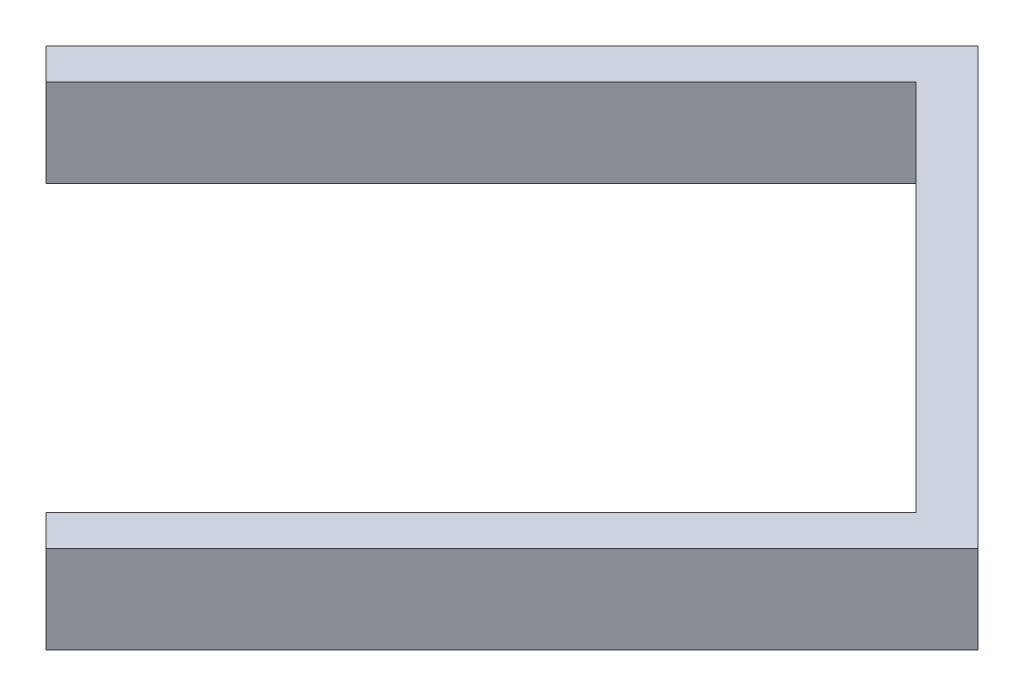
ISO-10303-21;
HEADER;
FILE_DESCRIPTION(('STEP AP214'),'2;1');
FILE_NAME('part.step','',(''),(''),'','','');
FILE_SCHEMA(('AUTOMOTIVE_DESIGN { 1 0 10303 214 1 1 1 1 }'));
ENDSEC;
DATA;
#1=APPLICATION_CONTEXT('core data for automotive mechanical design processes');
#2=APPLICATION_PROTOCOL_DEFINITION('international standard','automotive_design',2000,#1);
#3=PRODUCT_CONTEXT('',#1,'mechanical');
#4=PRODUCT('Part','Part','',(#3));
#5=PRODUCT_RELATED_PRODUCT_CATEGORY('part','',(#4));
#6=PRODUCT_DEFINITION_FORMATION('','',#4);
#7=PRODUCT_DEFINITION_CONTEXT('part definition',#1,'design');
#8=PRODUCT_DEFINITION('design','',#6,#7);
#9=PRODUCT_DEFINITION_SHAPE('','',#8);
#10=(LENGTH_UNIT() NAMED_UNIT(*) SI_UNIT(.MILLI.,.METRE.));
#11=(NAMED_UNIT(*) PLANE_ANGLE_UNIT() SI_UNIT($,.RADIAN.));
#12=(NAMED_UNIT(*) SI_UNIT($,.STERADIAN.) SOLID_ANGLE_UNIT());
#13=UNCERTAINTY_MEASURE_WITH_UNIT(LENGTH_MEASURE(1.E-05),#10,'distance_accuracy_value','');
#14=(GEOMETRIC_REPRESENTATION_CONTEXT(3) GLOBAL_UNCERTAINTY_ASSIGNED_CONTEXT((#13)) GLOBAL_UNIT_ASSIGNED_CONTEXT((#10,
#11,#12)) REPRESENTATION_CONTEXT('',''));
#15=CARTESIAN_POINT('',(0.,0.,0.));
#16=DIRECTION('',(0.,0.,1.));
#17=DIRECTION('',(1.,0.,0.));
#18=AXIS2_PLACEMENT_3D('',#15,#16,#17);
#19=CARTESIAN_POINT('',(-108.053527883218,50.8,-108.053527883218));
#20=DIRECTION('',(0.707106781186548,0.,0.707106781186547));
#21=DIRECTION('',(0.707106781186547,0.,-0.707106781186548));
#22=AXIS2_PLACEMENT_3D('',#19,#20,#21);
#23=PLANE('',#22);
#24=DIRECTION('',(-0.707106781186547,0.,0.707106781186548));
#25=VECTOR('',#24,1.);
#26=CARTESIAN_POINT('',(-108.053527883218,0.,-108.053527883218));
#27=LINE('',#26,#25);
#28=CARTESIAN_POINT('',(11.3038915641731,0.,-227.410947330609));
#29=VERTEX_POINT('',#28);
#30=CARTESIAN_POINT('',(-240.143279825763,0.,24.0362240593278));
#31=VERTEX_POINT('',#30);
#32=EDGE_CURVE('E138',#29,#31,#27,.T.);
#33=ORIENTED_EDGE('',*,*,#32,.F.);
#34=DIRECTION('',(0.,-1.,0.));
#35=VECTOR('',#34,1.);
#36=CARTESIAN_POINT('',(11.3038915641731,50.8,-227.410947330609));
#37=LINE('',#36,#35);
#38=CARTESIAN_POINT('',(11.3038915641731,50.8,-227.410947330609));
#39=VERTEX_POINT('',#38);
#40=EDGE_CURVE('E11',#39,#29,#37,.T.);
#41=ORIENTED_EDGE('',*,*,#40,.F.);
#42=DIRECTION('',(-0.707106781186547,0.,0.707106781186548));
#43=VECTOR('',#42,1.);
#44=CARTESIAN_POINT('',(-108.053527883218,50.8,-108.053527883218));
#45=LINE('',#44,#43);
#46=CARTESIAN_POINT('',(-240.143279825763,50.8,24.0362240593278));
#47=VERTEX_POINT('',#46);
#48=EDGE_CURVE('E159',#39,#47,#45,.T.);
#49=ORIENTED_EDGE('',*,*,#48,.T.);
#50=DIRECTION('',(0.,-1.,0.));
#51=VECTOR('',#50,1.);
#52=CARTESIAN_POINT('',(-240.143279825763,50.8,24.0362240593278));
#53=LINE('',#52,#51);
#54=EDGE_CURVE('E61',#47,#31,#53,.T.);
#55=ORIENTED_EDGE('',*,*,#54,.T.);
#56=EDGE_LOOP('',(#33,#41,#49,#55));
#57=FACE_BOUND('',#56,.T.);
#58=ADVANCED_FACE('F45',(#57),#23,.T.);
#59=CARTESIAN_POINT('',(119.357419447391,50.8,-119.357419447391));
#60=DIRECTION('',(-0.707106781186547,0.,0.707106781186548));
#61=DIRECTION('',(0.707106781186548,0.,0.707106781186547));
#62=AXIS2_PLACEMENT_3D('',#59,#60,#61);
#63=PLANE('',#62);
#64=CARTESIAN_POINT('',(119.357419447391,25.4,-119.357419447391));
#65=DIRECTION('',(-0.707106781186547,0.,0.707106781186548));
#66=DIRECTION('',(0.707106781186548,0.,0.707106781186547));
#67=AXIS2_PLACEMENT_3D('',#64,#65,#66);
#68=CIRCLE('',#67,6.35000000000003);
#69=CARTESIAN_POINT('',(114.867291386856,25.4,-123.847547507925));
#70=VERTEX_POINT('',#69);
#71=EDGE_CURVE('E141',#70,#70,#68,.T.);
#72=ORIENTED_EDGE('',*,*,#71,.F.);
#73=EDGE_LOOP('',(#72));
#74=FACE_BOUND('',#73,.T.);
#75=DIRECTION('',(-0.707106781186548,0.,-0.707106781186547));
#76=VECTOR('',#75,1.);
#77=CARTESIAN_POINT('',(119.357419447391,0.,-119.357419447391));
#78=LINE('',#77,#76);
#79=CARTESIAN_POINT('',(226.830038469833,0.,-11.884800424949));
#80=VERTEX_POINT('',#79);
#81=EDGE_CURVE('E140',#80,#29,#78,.T.);
#82=ORIENTED_EDGE('',*,*,#81,.F.);
#83=DIRECTION('',(0.,-1.,0.));
#84=VECTOR('',#83,1.);
#85=CARTESIAN_POINT('',(226.830038469833,50.8,-11.884800424949));
#86=LINE('',#85,#84);
#87=CARTESIAN_POINT('',(226.830038469833,50.8,-11.884800424949));
#88=VERTEX_POINT('',#87);
#89=EDGE_CURVE('E53',#88,#80,#86,.T.);
#90=ORIENTED_EDGE('',*,*,#89,.F.);
#91=DIRECTION('',(-0.707106781186548,0.,-0.707106781186547));
#92=VECTOR('',#91,1.);
#93=CARTESIAN_POINT('',(119.357419447391,50.8,-119.357419447391));
#94=LINE('',#93,#92);
#95=EDGE_CURVE('E185',#88,#39,#94,.T.);
#96=ORIENTED_EDGE('',*,*,#95,.T.);
#97=ORIENTED_EDGE('',*,*,#40,.T.);
#98=EDGE_LOOP('',(#82,#90,#96,#97));
#99=FACE_BOUND('',#98,.T.);
#100=ADVANCED_FACE('F176',(#74,#99),#63,.T.);
#101=CARTESIAN_POINT('',(107.472619022442,50.8,107.472619022442));
#102=DIRECTION('',(-0.707106781186547,0.,-0.707106781186548));
#103=DIRECTION('',(-0.707106781186548,0.,0.707106781186547));
#104=AXIS2_PLACEMENT_3D('',#101,#102,#103);
#105=PLANE('',#104);
#106=DIRECTION('',(0.707106781186548,0.,-0.707106781186547));
#107=VECTOR('',#106,1.);
#108=CARTESIAN_POINT('',(107.472619022442,0.,107.472619022442));
#109=LINE('',#108,#107);
#110=CARTESIAN_POINT('',(-24.6171329201035,0.,239.562370964987));
#111=VERTEX_POINT('',#110);
#112=EDGE_CURVE('E144',#111,#80,#109,.T.);
#113=ORIENTED_EDGE('',*,*,#112,.F.);
#114=DIRECTION('',(0.,-1.,0.));
#115=VECTOR('',#114,1.);
#116=CARTESIAN_POINT('',(-24.6171329201035,50.8,239.562370964987));
#117=LINE('',#116,#115);
#118=CARTESIAN_POINT('',(-24.6171329201035,50.8,239.562370964987));
#119=VERTEX_POINT('',#118);
#120=EDGE_CURVE('E165',#119,#111,#117,.T.);
#121=ORIENTED_EDGE('',*,*,#120,.F.);
#122=DIRECTION('',(0.707106781186548,0.,-0.707106781186547));
#123=VECTOR('',#122,1.);
#124=CARTESIAN_POINT('',(107.472619022442,50.8,107.472619022442));
#125=LINE('',#124,#123);
#126=EDGE_CURVE('E172',#119,#88,#125,.T.);
#127=ORIENTED_EDGE('',*,*,#126,.T.);
#128=ORIENTED_EDGE('',*,*,#89,.T.);
#129=EDGE_LOOP('',(#113,#121,#127,#128));
#130=FACE_BOUND('',#129,.T.);
#131=ADVANCED_FACE('F170',(#130),#105,.T.);
#132=CARTESIAN_POINT('',(-132.089751942545,50.8,132.089751942545));
#133=DIRECTION('',(-0.707106781186548,0.,0.707106781186548));
#134=DIRECTION('',(0.707106781186548,0.,0.707106781186548));
#135=AXIS2_PLACEMENT_3D('',#132,#133,#134);
#136=PLANE('',#135);
#137=DIRECTION('',(-0.707106781186548,0.,-0.707106781186548));
#138=VECTOR('',#137,1.);
#139=CARTESIAN_POINT('',(-132.089751942545,0.,132.089751942545));
#140=LINE('',#139,#138);
#141=CARTESIAN_POINT('',(-6.65662067796521,0.,257.522883207125));
#142=VERTEX_POINT('',#141);
#143=EDGE_CURVE('E147',#142,#111,#140,.T.);
#144=ORIENTED_EDGE('',*,*,#143,.F.);
#145=DIRECTION('',(0.,-1.,0.));
#146=VECTOR('',#145,1.);
#147=CARTESIAN_POINT('',(-6.65662067796521,50.8,257.522883207125));
#148=LINE('',#147,#146);
#149=CARTESIAN_POINT('',(-6.65662067796521,50.8,257.522883207125));
#150=VERTEX_POINT('',#149);
#151=EDGE_CURVE('E163',#150,#142,#148,.T.);
#152=ORIENTED_EDGE('',*,*,#151,.F.);
#153=DIRECTION('',(-0.707106781186548,0.,-0.707106781186548));
#154=VECTOR('',#153,1.);
#155=CARTESIAN_POINT('',(-132.089751942545,50.8,132.089751942545));
#156=LINE('',#155,#154);
#157=EDGE_CURVE('E184',#150,#119,#156,.T.);
#158=ORIENTED_EDGE('',*,*,#157,.T.);
#159=ORIENTED_EDGE('',*,*,#120,.T.);
#160=EDGE_LOOP('',(#144,#152,#158,#159));
#161=FACE_BOUND('',#160,.T.);
#162=ADVANCED_FACE('F182',(#161),#136,.T.);
#163=CARTESIAN_POINT('',(125.43313126458,50.8,125.43313126458));
#164=DIRECTION('',(0.707106781186548,0.,0.707106781186548));
#165=DIRECTION('',(0.707106781186548,0.,-0.707106781186548));
#166=AXIS2_PLACEMENT_3D('',#163,#164,#165);
#167=PLANE('',#166);
#168=DIRECTION('',(-0.707106781186548,0.,0.707106781186548));
#169=VECTOR('',#168,1.);
#170=CARTESIAN_POINT('',(125.43313126458,0.,125.43313126458));
#171=LINE('',#170,#169);
#172=CARTESIAN_POINT('',(262.751062954109,0.,-11.8848004249491));
#173=VERTEX_POINT('',#172);
#174=EDGE_CURVE('E150',#173,#142,#171,.T.);
#175=ORIENTED_EDGE('',*,*,#174,.F.);
#176=DIRECTION('',(0.,-1.,0.));
#177=VECTOR('',#176,1.);
#178=CARTESIAN_POINT('',(262.751062954109,50.8,-11.8848004249491));
#179=LINE('',#178,#177);
#180=CARTESIAN_POINT('',(262.751062954109,50.8,-11.8848004249491));
#181=VERTEX_POINT('',#180);
#182=EDGE_CURVE('E120',#181,#173,#179,.T.);
#183=ORIENTED_EDGE('',*,*,#182,.F.);
#184=DIRECTION('',(-0.707106781186548,0.,0.707106781186548));
#185=VECTOR('',#184,1.);
#186=CARTESIAN_POINT('',(125.43313126458,50.8,125.43313126458));
#187=LINE('',#186,#185);
#188=EDGE_CURVE('E130',#181,#150,#187,.T.);
#189=ORIENTED_EDGE('',*,*,#188,.T.);
#190=ORIENTED_EDGE('',*,*,#151,.T.);
#191=EDGE_LOOP('',(#175,#183,#189,#190));
#192=FACE_BOUND('',#191,.T.);
#193=ADVANCED_FACE('F191',(#192),#167,.T.);
#194=CARTESIAN_POINT('',(137.317931689529,50.8,-137.317931689529));
#195=DIRECTION('',(0.707106781186548,0.,-0.707106781186548));
#196=DIRECTION('',(-0.707106781186548,0.,-0.707106781186548));
#197=AXIS2_PLACEMENT_3D('',#194,#195,#196);
#198=PLANE('',#197);
#199=CARTESIAN_POINT('',(137.317931689529,25.4,-137.317931689529));
#200=DIRECTION('',(0.707106781186548,0.,-0.707106781186547));
#201=DIRECTION('',(-0.707106781186547,0.,-0.707106781186548));
#202=AXIS2_PLACEMENT_3D('',#199,#200,#201);
#203=CIRCLE('',#202,6.35000000000003);
#204=CARTESIAN_POINT('',(132.827803628995,25.4,-141.808059750064));
#205=VERTEX_POINT('',#204);
#206=EDGE_CURVE('E225',#205,#205,#203,.T.);
#207=ORIENTED_EDGE('',*,*,#206,.F.);
#208=EDGE_LOOP('',(#207));
#209=FACE_BOUND('',#208,.T.);
#210=DIRECTION('',(0.707106781186548,0.,0.707106781186548));
#211=VECTOR('',#210,1.);
#212=CARTESIAN_POINT('',(137.317931689529,0.,-137.317931689529));
#213=LINE('',#212,#211);
#214=CARTESIAN_POINT('',(11.303891564173,0.,-263.331971814885));
#215=VERTEX_POINT('',#214);
#216=EDGE_CURVE('E116',#215,#173,#213,.T.);
#217=ORIENTED_EDGE('',*,*,#216,.F.);
#218=DIRECTION('',(0.,-1.,0.));
#219=VECTOR('',#218,1.);
#220=CARTESIAN_POINT('',(11.303891564173,50.8,-263.331971814885));
#221=LINE('',#220,#219);
#222=CARTESIAN_POINT('',(11.303891564173,50.8,-263.331971814885));
#223=VERTEX_POINT('',#222);
#224=EDGE_CURVE('E111',#223,#215,#221,.T.);
#225=ORIENTED_EDGE('',*,*,#224,.F.);
#226=DIRECTION('',(0.707106781186548,0.,0.707106781186548));
#227=VECTOR('',#226,1.);
#228=CARTESIAN_POINT('',(137.317931689529,50.8,-137.317931689529));
#229=LINE('',#228,#227);
#230=EDGE_CURVE('E114',#223,#181,#229,.T.);
#231=ORIENTED_EDGE('',*,*,#230,.T.);
#232=ORIENTED_EDGE('',*,*,#182,.T.);
#233=EDGE_LOOP('',(#217,#225,#231,#232));
#234=FACE_BOUND('',#233,.T.);
#235=ADVANCED_FACE('F113',(#209,#234),#198,.T.);
#236=CARTESIAN_POINT('',(-126.014040125356,50.8,-126.014040125356));
#237=DIRECTION('',(-0.707106781186548,0.,-0.707106781186547));
#238=DIRECTION('',(-0.707106781186547,0.,0.707106781186548));
#239=AXIS2_PLACEMENT_3D('',#236,#237,#238);
#240=PLANE('',#239);
#241=DIRECTION('',(0.707106781186547,0.,-0.707106781186548));
#242=VECTOR('',#241,1.);
#243=CARTESIAN_POINT('',(-126.014040125356,0.,-126.014040125356));
#244=LINE('',#243,#242);
#245=CARTESIAN_POINT('',(-258.103792067901,0.,6.07571181718949));
#246=VERTEX_POINT('',#245);
#247=EDGE_CURVE('E154',#246,#215,#244,.T.);
#248=ORIENTED_EDGE('',*,*,#247,.F.);
#249=DIRECTION('',(0.,-1.,0.));
#250=VECTOR('',#249,1.);
#251=CARTESIAN_POINT('',(-258.103792067901,50.8,6.07571181718949));
#252=LINE('',#251,#250);
#253=CARTESIAN_POINT('',(-258.103792067901,50.8,6.07571181718949));
#254=VERTEX_POINT('',#253);
#255=EDGE_CURVE('E86',#254,#246,#252,.T.);
#256=ORIENTED_EDGE('',*,*,#255,.F.);
#257=DIRECTION('',(0.707106781186547,0.,-0.707106781186548));
#258=VECTOR('',#257,1.);
#259=CARTESIAN_POINT('',(-126.014040125356,50.8,-126.014040125356));
#260=LINE('',#259,#258);
#261=EDGE_CURVE('E127',#254,#223,#260,.T.);
#262=ORIENTED_EDGE('',*,*,#261,.T.);
#263=ORIENTED_EDGE('',*,*,#224,.T.);
#264=EDGE_LOOP('',(#248,#256,#262,#263));
#265=FACE_BOUND('',#264,.T.);
#266=ADVANCED_FACE('F132',(#265),#240,.T.);
#267=CARTESIAN_POINT('',(-132.089751942545,50.8,132.089751942545));
#268=DIRECTION('',(-0.707106781186548,0.,0.707106781186548));
#269=DIRECTION('',(0.707106781186548,0.,0.707106781186548));
#270=AXIS2_PLACEMENT_3D('',#267,#268,#269);
#271=PLANE('',#270);
#272=DIRECTION('',(-0.707106781186548,0.,-0.707106781186548));
#273=VECTOR('',#272,1.);
#274=CARTESIAN_POINT('',(-132.089751942545,0.,132.089751942545));
#275=LINE('',#274,#273);
#276=EDGE_CURVE('E156',#31,#246,#275,.T.);
#277=ORIENTED_EDGE('',*,*,#276,.F.);
#278=ORIENTED_EDGE('',*,*,#54,.F.);
#279=DIRECTION('',(-0.707106781186548,0.,-0.707106781186548));
#280=VECTOR('',#279,1.);
#281=CARTESIAN_POINT('',(-132.089751942545,50.8,132.089751942545));
#282=LINE('',#281,#280);
#283=EDGE_CURVE('E133',#47,#254,#282,.T.);
#284=ORIENTED_EDGE('',*,*,#283,.T.);
#285=ORIENTED_EDGE('',*,*,#255,.T.);
#286=EDGE_LOOP('',(#277,#278,#284,#285));
#287=FACE_BOUND('',#286,.T.);
#288=ADVANCED_FACE('F192',(#287),#271,.T.);
#289=CARTESIAN_POINT('',(0.,50.8,0.));
#290=DIRECTION('',(0.,1.,0.));
#291=DIRECTION('',(0.,0.,1.));
#292=AXIS2_PLACEMENT_3D('',#289,#290,#291);
#293=PLANE('',#292);
#294=ORIENTED_EDGE('',*,*,#48,.F.);
#295=ORIENTED_EDGE('',*,*,#95,.F.);
#296=ORIENTED_EDGE('',*,*,#126,.F.);
#297=ORIENTED_EDGE('',*,*,#157,.F.);
#298=ORIENTED_EDGE('',*,*,#188,.F.);
#299=ORIENTED_EDGE('',*,*,#230,.F.);
#300=ORIENTED_EDGE('',*,*,#261,.F.);
#301=ORIENTED_EDGE('',*,*,#283,.F.);
#302=EDGE_LOOP('',(#294,#295,#296,#297,#298,#299,#300,#301));
#303=FACE_BOUND('',#302,.T.);
#304=ADVANCED_FACE('F125',(#303),#293,.T.);
#305=CARTESIAN_POINT('',(0.,0.,0.));
#306=DIRECTION('',(0.,1.,0.));
#307=DIRECTION('',(0.,0.,1.));
#308=AXIS2_PLACEMENT_3D('',#305,#306,#307);
#309=PLANE('',#308);
#310=ORIENTED_EDGE('',*,*,#32,.T.);
#311=ORIENTED_EDGE('',*,*,#276,.T.);
#312=ORIENTED_EDGE('',*,*,#247,.T.);
#313=ORIENTED_EDGE('',*,*,#216,.T.);
#314=ORIENTED_EDGE('',*,*,#174,.T.);
#315=ORIENTED_EDGE('',*,*,#143,.T.);
#316=ORIENTED_EDGE('',*,*,#112,.T.);
#317=ORIENTED_EDGE('',*,*,#81,.T.);
#318=EDGE_LOOP('',(#310,#311,#312,#313,#314,#315,#316,#317));
#319=FACE_BOUND('',#318,.T.);
#320=ADVANCED_FACE('F178',(#319),#309,.F.);
#321=CARTESIAN_POINT('',(101.396907205253,25.4,-101.396907205253));
#322=DIRECTION('',(0.707106781186548,0.,-0.707106781186547));
#323=DIRECTION('',(-0.707106781186547,0.,-0.707106781186548));
#324=AXIS2_PLACEMENT_3D('',#321,#322,#323);
#325=CYLINDRICAL_SURFACE('',#324,6.35000000000003);
#326=CARTESIAN_POINT('',(114.867291386856,25.4,-123.847547507925));
#327=CARTESIAN_POINT('',(115.054380056045,25.4,-124.034636177114));
#328=CARTESIAN_POINT('',(115.241468725234,25.4,-124.221724846303));
#329=CARTESIAN_POINT('',(115.615646063612,25.4,-124.595902184681));
#330=CARTESIAN_POINT('',(115.802734732801,25.4,-124.78299085387));
#331=CARTESIAN_POINT('',(116.176912071179,25.4,-125.157168192248));
#332=CARTESIAN_POINT('',(116.364000740368,25.4,-125.344256861437));
#333=CARTESIAN_POINT('',(116.738178078746,25.4,-125.718434199815));
#334=CARTESIAN_POINT('',(116.925266747935,25.4,-125.905522869004));
#335=CARTESIAN_POINT('',(117.299444086313,25.4,-126.279700207382));
#336=CARTESIAN_POINT('',(117.486532755501,25.4,-126.466788876571));
#337=CARTESIAN_POINT('',(117.860710093879,25.4,-126.840966214949));
#338=CARTESIAN_POINT('',(118.047798763068,25.4,-127.028054884137));
#339=CARTESIAN_POINT('',(118.421976101446,25.4,-127.402232222515));
#340=CARTESIAN_POINT('',(118.609064770635,25.4,-127.589320891704));
#341=CARTESIAN_POINT('',(118.983242109013,25.4,-127.963498230082));
#342=CARTESIAN_POINT('',(119.170330778202,25.4,-128.150586899271));
#343=CARTESIAN_POINT('',(119.54450811658,25.4,-128.524764237649));
#344=CARTESIAN_POINT('',(119.731596785769,25.4,-128.711852906838));
#345=CARTESIAN_POINT('',(120.105774124147,25.4,-129.086030245216));
#346=CARTESIAN_POINT('',(120.292862793336,25.4,-129.273118914405));
#347=CARTESIAN_POINT('',(120.667040131713,25.4,-129.647296252783));
#348=CARTESIAN_POINT('',(120.854128800902,25.4,-129.834384921972));
#349=CARTESIAN_POINT('',(121.22830613928,25.4,-130.208562260349));
#350=CARTESIAN_POINT('',(121.415394808469,25.4,-130.395650929538));
#351=CARTESIAN_POINT('',(121.789572146847,25.4,-130.769828267916));
#352=CARTESIAN_POINT('',(121.976660816036,25.4,-130.956916937105));
#353=CARTESIAN_POINT('',(122.350838154414,25.4,-131.331094275483));
#354=CARTESIAN_POINT('',(122.537926823603,25.4,-131.518182944672));
#355=CARTESIAN_POINT('',(122.912104161981,25.4,-131.89236028305));
#356=CARTESIAN_POINT('',(123.09919283117,25.4,-132.079448952239));
#357=CARTESIAN_POINT('',(123.473370169548,25.4,-132.453626290617));
#358=CARTESIAN_POINT('',(123.660458838737,25.4,-132.640714959806));
#359=CARTESIAN_POINT('',(124.034636177114,25.4,-133.014892298184));
#360=CARTESIAN_POINT('',(124.221724846303,25.4,-133.201980967373));
#361=CARTESIAN_POINT('',(124.595902184681,25.4,-133.57615830575));
#362=CARTESIAN_POINT('',(124.78299085387,25.4,-133.763246974939));
#363=CARTESIAN_POINT('',(125.157168192248,25.4,-134.137424313317));
#364=CARTESIAN_POINT('',(125.344256861437,25.4,-134.324512982506));
#365=CARTESIAN_POINT('',(125.718434199815,25.4,-134.698690320884));
#366=CARTESIAN_POINT('',(125.905522869004,25.4,-134.885778990073));
#367=CARTESIAN_POINT('',(126.279700207382,25.4,-135.259956328451));
#368=CARTESIAN_POINT('',(126.466788876571,25.4,-135.44704499764));
#369=CARTESIAN_POINT('',(126.840966214949,25.4,-135.821222336018));
#370=CARTESIAN_POINT('',(127.028054884137,25.4,-136.008311005207));
#371=CARTESIAN_POINT('',(127.402232222515,25.4,-136.382488343584));
#372=CARTESIAN_POINT('',(127.589320891704,25.4,-136.569577012773));
#373=CARTESIAN_POINT('',(127.963498230082,25.4,-136.943754351151));
#374=CARTESIAN_POINT('',(128.150586899271,25.4,-137.13084302034));
#375=CARTESIAN_POINT('',(128.524764237649,25.4,-137.505020358718));
#376=CARTESIAN_POINT('',(128.711852906838,25.4,-137.692109027907));
#377=CARTESIAN_POINT('',(129.086030245216,25.4,-138.066286366285));
#378=CARTESIAN_POINT('',(129.273118914405,25.4,-138.253375035474));
#379=CARTESIAN_POINT('',(129.647296252783,25.4,-138.627552373852));
#380=CARTESIAN_POINT('',(129.834384921972,25.4,-138.814641043041));
#381=CARTESIAN_POINT('',(130.208562260349,25.4,-139.188818381419));
#382=CARTESIAN_POINT('',(130.395650929538,25.4,-139.375907050608));
#383=CARTESIAN_POINT('',(130.769828267916,25.4,-139.750084388985));
#384=CARTESIAN_POINT('',(130.956916937105,25.4,-139.937173058174));
#385=CARTESIAN_POINT('',(131.331094275483,25.4,-140.311350396552));
#386=CARTESIAN_POINT('',(131.518182944672,25.4,-140.498439065741));
#387=CARTESIAN_POINT('',(131.89236028305,25.4,-140.872616404119));
#388=CARTESIAN_POINT('',(132.079448952239,25.4,-141.059705073308));
#389=CARTESIAN_POINT('',(132.453626290617,25.4,-141.433882411686));
#390=CARTESIAN_POINT('',(132.640714959806,25.4,-141.620971080875));
#391=CARTESIAN_POINT('',(132.827803628995,25.4,-141.808059750064));
#392=B_SPLINE_CURVE_WITH_KNOTS('',3,(#326,#327,#328,#329,#330,#331,#332,#333,#334,#335,#336,
#337,#338,#339,#340,#341,#342,#343,#344,#345,#346,#347,#348,#349,#350,#351,#352,#353,#354,#355,
#356,#357,#358,#359,#360,#361,#362,#363,#364,#365,#366,#367,#368,#369,#370,#371,#372,#373,#374,
#375,#376,#377,#378,#379,#380,#381,#382,#383,#384,#385,#386,#387,#388,#389,#390,#391),
.UNSPECIFIED.,.F.,.F.,(4,2,2,2,2,2,2,2,2,2,2,2,2,2,2,2,2,2,2,2,2,2,2,2,2,2,2,2,2,2,2,2,4),(0.,
0.793750000000007,1.58750000000001,2.38125,3.17499999999999,3.96875,4.7625,5.55624999999999,
6.34999999999999,7.14374999999999,7.93749999999999,8.73124999999998,9.52499999999999,10.31875,
11.1125,11.90625,12.7,13.49375,14.2875,15.08125,15.875,16.66875,17.4624999999999,18.25625,19.05,
19.84375,20.6375,21.43125,22.2249999999999,23.01875,23.8125,24.6062499999999,25.3999999999999),.UNSPECIFIED.);
#393=EDGE_CURVE('BSEAM231',#70,#205,#392,.T.);
#394=ORIENTED_EDGE('',*,*,#71,.T.);
#395=ORIENTED_EDGE('',*,*,#206,.T.);
#396=ORIENTED_EDGE('',*,*,#393,.T.);
#397=ORIENTED_EDGE('',*,*,#393,.F.);
#398=EDGE_LOOP('',(#394,#396,#395,#397));
#399=FACE_BOUND('',#398,.T.);
#400=ADVANCED_FACE('F231',(#399),#325,.F.);
#401=CLOSED_SHELL('',(#58,#100,#131,#162,#193,#235,#266,#288,#304,#320,#400));
#402=MANIFOLD_SOLID_BREP('B2',#401);
#403=ADVANCED_BREP_SHAPE_REPRESENTATION('',(#18,#402),#14);
#404=SHAPE_DEFINITION_REPRESENTATION(#9,#403);
ENDSEC;
END-ISO-10303-21;
